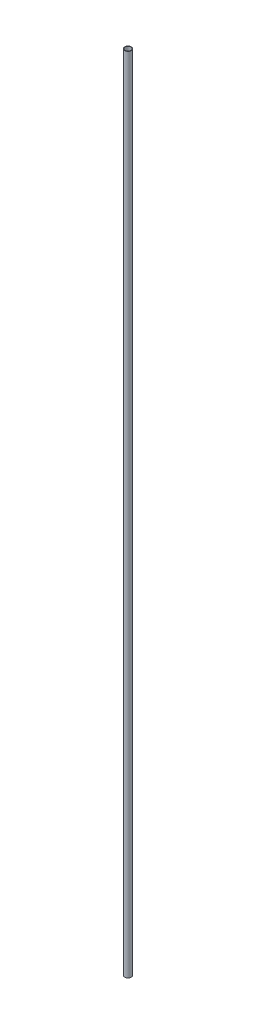
ISO-10303-21;
HEADER;
FILE_DESCRIPTION(('STEP AP214'),'2;1');
FILE_NAME('part.step','',(''),(''),'','','');
FILE_SCHEMA(('AUTOMOTIVE_DESIGN { 1 0 10303 214 1 1 1 1 }'));
ENDSEC;
DATA;
#1=APPLICATION_CONTEXT('core data for automotive mechanical design processes');
#2=APPLICATION_PROTOCOL_DEFINITION('international standard','automotive_design',2000,#1);
#3=PRODUCT_CONTEXT('',#1,'mechanical');
#4=PRODUCT('Part','Part','',(#3));
#5=PRODUCT_RELATED_PRODUCT_CATEGORY('part','',(#4));
#6=PRODUCT_DEFINITION_FORMATION('','',#4);
#7=PRODUCT_DEFINITION_CONTEXT('part definition',#1,'design');
#8=PRODUCT_DEFINITION('design','',#6,#7);
#9=PRODUCT_DEFINITION_SHAPE('','',#8);
#10=(LENGTH_UNIT() NAMED_UNIT(*) SI_UNIT(.MILLI.,.METRE.));
#11=(NAMED_UNIT(*) PLANE_ANGLE_UNIT() SI_UNIT($,.RADIAN.));
#12=(NAMED_UNIT(*) SI_UNIT($,.STERADIAN.) SOLID_ANGLE_UNIT());
#13=UNCERTAINTY_MEASURE_WITH_UNIT(LENGTH_MEASURE(1.E-05),#10,'distance_accuracy_value','');
#14=(GEOMETRIC_REPRESENTATION_CONTEXT(3) GLOBAL_UNCERTAINTY_ASSIGNED_CONTEXT((#13)) GLOBAL_UNIT_ASSIGNED_CONTEXT((#10,
#11,#12)) REPRESENTATION_CONTEXT('',''));
#15=CARTESIAN_POINT('',(0.,0.,0.));
#16=DIRECTION('',(0.,0.,1.));
#17=DIRECTION('',(1.,0.,0.));
#18=AXIS2_PLACEMENT_3D('',#15,#16,#17);
#19=CARTESIAN_POINT('',(0.,970.,0.));
#20=DIRECTION('',(0.,1.,0.));
#21=DIRECTION('',(0.,0.,1.));
#22=AXIS2_PLACEMENT_3D('',#19,#20,#21);
#23=PLANE('',#22);
#24=CARTESIAN_POINT('',(0.,970.,0.));
#25=DIRECTION('',(0.,1.,0.));
#26=DIRECTION('',(0.,0.,1.));
#27=AXIS2_PLACEMENT_3D('',#24,#25,#26);
#28=CIRCLE('',#27,4.);
#29=CARTESIAN_POINT('',(0.,970.,4.));
#30=VERTEX_POINT('',#29);
#31=EDGE_CURVE('E10',#30,#30,#28,.T.);
#32=ORIENTED_EDGE('',*,*,#31,.T.);
#33=EDGE_LOOP('',(#32));
#34=FACE_BOUND('',#33,.T.);
#35=CARTESIAN_POINT('',(0.,970.,0.));
#36=DIRECTION('',(0.,1.,0.));
#37=DIRECTION('',(0.,0.,1.));
#38=AXIS2_PLACEMENT_3D('',#35,#36,#37);
#39=CIRCLE('',#38,3.5);
#40=CARTESIAN_POINT('',(0.,970.,3.5));
#41=VERTEX_POINT('',#40);
#42=EDGE_CURVE('E41',#41,#41,#39,.T.);
#43=ORIENTED_EDGE('',*,*,#42,.F.);
#44=EDGE_LOOP('',(#43));
#45=FACE_BOUND('',#44,.T.);
#46=ADVANCED_FACE('F30',(#34,#45),#23,.T.);
#47=CARTESIAN_POINT('',(0.,0.,0.));
#48=DIRECTION('',(0.,1.,0.));
#49=DIRECTION('',(0.,0.,1.));
#50=AXIS2_PLACEMENT_3D('',#47,#48,#49);
#51=PLANE('',#50);
#52=CARTESIAN_POINT('',(0.,0.,0.));
#53=DIRECTION('',(0.,1.,0.));
#54=DIRECTION('',(0.,0.,1.));
#55=AXIS2_PLACEMENT_3D('',#52,#53,#54);
#56=CIRCLE('',#55,4.);
#57=CARTESIAN_POINT('',(0.,0.,4.));
#58=VERTEX_POINT('',#57);
#59=EDGE_CURVE('E34',#58,#58,#56,.T.);
#60=ORIENTED_EDGE('',*,*,#59,.F.);
#61=EDGE_LOOP('',(#60));
#62=FACE_BOUND('',#61,.T.);
#63=CARTESIAN_POINT('',(0.,0.,0.));
#64=DIRECTION('',(0.,1.,0.));
#65=DIRECTION('',(0.,0.,1.));
#66=AXIS2_PLACEMENT_3D('',#63,#64,#65);
#67=CIRCLE('',#66,3.5);
#68=CARTESIAN_POINT('',(0.,0.,3.5));
#69=VERTEX_POINT('',#68);
#70=EDGE_CURVE('E43',#69,#69,#67,.T.);
#71=ORIENTED_EDGE('',*,*,#70,.T.);
#72=EDGE_LOOP('',(#71));
#73=FACE_BOUND('',#72,.T.);
#74=ADVANCED_FACE('F53',(#62,#73),#51,.F.);
#75=CARTESIAN_POINT('',(0.,970.,0.));
#76=DIRECTION('',(0.,-1.,0.));
#77=DIRECTION('',(0.,0.,-1.));
#78=AXIS2_PLACEMENT_3D('',#75,#76,#77);
#79=CYLINDRICAL_SURFACE('',#78,4.);
#80=ORIENTED_EDGE('',*,*,#31,.F.);
#81=EDGE_LOOP('',(#80));
#82=FACE_BOUND('',#81,.T.);
#83=ORIENTED_EDGE('',*,*,#59,.T.);
#84=EDGE_LOOP('',(#83));
#85=FACE_BOUND('',#84,.T.);
#86=ADVANCED_FACE('F32',(#82,#85),#79,.T.);
#87=CARTESIAN_POINT('',(0.,970.,0.));
#88=DIRECTION('',(0.,-1.,0.));
#89=DIRECTION('',(0.,0.,-1.));
#90=AXIS2_PLACEMENT_3D('',#87,#88,#89);
#91=CYLINDRICAL_SURFACE('',#90,3.5);
#92=ORIENTED_EDGE('',*,*,#42,.T.);
#93=EDGE_LOOP('',(#92));
#94=FACE_BOUND('',#93,.T.);
#95=ORIENTED_EDGE('',*,*,#70,.F.);
#96=EDGE_LOOP('',(#95));
#97=FACE_BOUND('',#96,.T.);
#98=ADVANCED_FACE('F49',(#94,#97),#91,.F.);
#99=CLOSED_SHELL('',(#46,#74,#86,#98));
#100=MANIFOLD_SOLID_BREP('B2',#99);
#101=ADVANCED_BREP_SHAPE_REPRESENTATION('',(#18,#100),#14);
#102=SHAPE_DEFINITION_REPRESENTATION(#9,#101);
ENDSEC;
END-ISO-10303-21;
